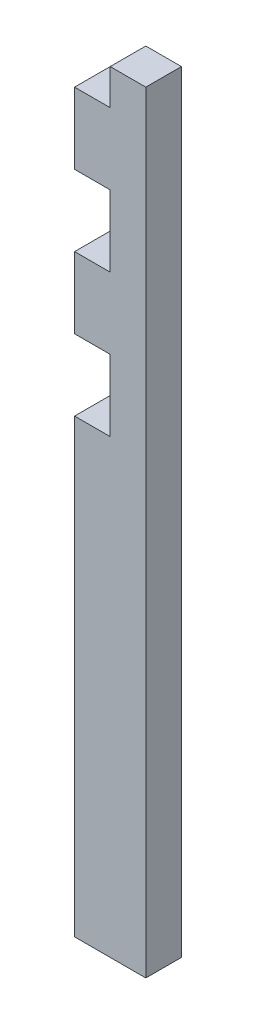
ISO-10303-21;
HEADER;
FILE_DESCRIPTION(('STEP AP214'),'2;1');
FILE_NAME('part.step','',(''),(''),'','','');
FILE_SCHEMA(('AUTOMOTIVE_DESIGN { 1 0 10303 214 1 1 1 1 }'));
ENDSEC;
DATA;
#1=APPLICATION_CONTEXT('core data for automotive mechanical design processes');
#2=APPLICATION_PROTOCOL_DEFINITION('international standard','automotive_design',2000,#1);
#3=PRODUCT_CONTEXT('',#1,'mechanical');
#4=PRODUCT('Part','Part','',(#3));
#5=PRODUCT_RELATED_PRODUCT_CATEGORY('part','',(#4));
#6=PRODUCT_DEFINITION_FORMATION('','',#4);
#7=PRODUCT_DEFINITION_CONTEXT('part definition',#1,'design');
#8=PRODUCT_DEFINITION('design','',#6,#7);
#9=PRODUCT_DEFINITION_SHAPE('','',#8);
#10=(LENGTH_UNIT() NAMED_UNIT(*) SI_UNIT(.MILLI.,.METRE.));
#11=(NAMED_UNIT(*) PLANE_ANGLE_UNIT() SI_UNIT($,.RADIAN.));
#12=(NAMED_UNIT(*) SI_UNIT($,.STERADIAN.) SOLID_ANGLE_UNIT());
#13=UNCERTAINTY_MEASURE_WITH_UNIT(LENGTH_MEASURE(1.E-05),#10,'distance_accuracy_value','');
#14=(GEOMETRIC_REPRESENTATION_CONTEXT(3) GLOBAL_UNCERTAINTY_ASSIGNED_CONTEXT((#13)) GLOBAL_UNIT_ASSIGNED_CONTEXT((#10,
#11,#12)) REPRESENTATION_CONTEXT('',''));
#15=CARTESIAN_POINT('',(0.,0.,0.));
#16=DIRECTION('',(0.,0.,1.));
#17=DIRECTION('',(1.,0.,0.));
#18=AXIS2_PLACEMENT_3D('',#15,#16,#17);
#19=CARTESIAN_POINT('',(0.,0.,6.));
#20=DIRECTION('',(-1.,0.,0.));
#21=DIRECTION('',(0.,0.,1.));
#22=AXIS2_PLACEMENT_3D('',#19,#20,#21);
#23=PLANE('',#22);
#24=DIRECTION('',(0.,0.,-1.));
#25=VECTOR('',#24,1.);
#26=CARTESIAN_POINT('',(0.,94.,6.001));
#27=LINE('',#26,#25);
#28=CARTESIAN_POINT('',(0.,94.,6.));
#29=VERTEX_POINT('',#28);
#30=CARTESIAN_POINT('',(0.,94.,0.));
#31=VERTEX_POINT('',#30);
#32=EDGE_CURVE('E153',#29,#31,#27,.T.);
#33=ORIENTED_EDGE('',*,*,#32,.T.);
#34=DIRECTION('',(0.,1.,0.));
#35=VECTOR('',#34,1.);
#36=CARTESIAN_POINT('',(0.,0.,0.));
#37=LINE('',#36,#35);
#38=CARTESIAN_POINT('',(-5.759281940243E-13,82.,0.));
#39=VERTEX_POINT('',#38);
#40=EDGE_CURVE('E182',#39,#31,#37,.T.);
#41=ORIENTED_EDGE('',*,*,#40,.F.);
#42=DIRECTION('',(0.,0.,-1.));
#43=VECTOR('',#42,1.);
#44=CARTESIAN_POINT('',(-5.759281940243E-13,82.,6.001));
#45=LINE('',#44,#43);
#46=CARTESIAN_POINT('',(0.,82.,6.));
#47=VERTEX_POINT('',#46);
#48=EDGE_CURVE('E280',#47,#39,#45,.T.);
#49=ORIENTED_EDGE('',*,*,#48,.F.);
#50=DIRECTION('',(0.,1.,0.));
#51=VECTOR('',#50,1.);
#52=CARTESIAN_POINT('',(0.,0.,6.));
#53=LINE('',#52,#51);
#54=EDGE_CURVE('E185',#47,#29,#53,.T.);
#55=ORIENTED_EDGE('',*,*,#54,.T.);
#56=EDGE_LOOP('',(#33,#41,#49,#55));
#57=FACE_BOUND('',#56,.T.);
#58=ADVANCED_FACE('F41',(#57),#23,.T.);
#59=DIRECTION('',(0.,0.,-1.));
#60=VECTOR('',#59,1.);
#61=CARTESIAN_POINT('',(-5.82867087928207E-13,70.,6.001));
#62=LINE('',#61,#60);
#63=CARTESIAN_POINT('',(0.,70.,6.));
#64=VERTEX_POINT('',#63);
#65=CARTESIAN_POINT('',(-5.82867087928207E-13,70.,0.));
#66=VERTEX_POINT('',#65);
#67=EDGE_CURVE('E276',#64,#66,#62,.T.);
#68=ORIENTED_EDGE('',*,*,#67,.T.);
#69=CARTESIAN_POINT('',(-1.16573417585641E-12,58.,0.));
#70=VERTEX_POINT('',#69);
#71=EDGE_CURVE('E181',#70,#66,#37,.T.);
#72=ORIENTED_EDGE('',*,*,#71,.F.);
#73=DIRECTION('',(0.,0.,-1.));
#74=VECTOR('',#73,1.);
#75=CARTESIAN_POINT('',(-1.16573417585641E-12,58.,6.001));
#76=LINE('',#75,#74);
#77=CARTESIAN_POINT('',(0.,58.,6.));
#78=VERTEX_POINT('',#77);
#79=EDGE_CURVE('E233',#78,#70,#76,.T.);
#80=ORIENTED_EDGE('',*,*,#79,.F.);
#81=EDGE_CURVE('E188',#78,#64,#53,.T.);
#82=ORIENTED_EDGE('',*,*,#81,.T.);
#83=EDGE_LOOP('',(#68,#72,#80,#82));
#84=FACE_BOUND('',#83,.T.);
#85=ADVANCED_FACE('F274',(#84),#23,.T.);
#86=DIRECTION('',(0.,0.,-1.));
#87=VECTOR('',#86,1.);
#88=CARTESIAN_POINT('',(-1.17267306976032E-12,46.,6.001));
#89=LINE('',#88,#87);
#90=CARTESIAN_POINT('',(0.,46.,6.));
#91=VERTEX_POINT('',#90);
#92=CARTESIAN_POINT('',(-1.17267306976032E-12,46.,0.));
#93=VERTEX_POINT('',#92);
#94=EDGE_CURVE('E201',#91,#93,#89,.T.);
#95=ORIENTED_EDGE('',*,*,#94,.T.);
#96=CARTESIAN_POINT('',(0.,-30.,0.));
#97=VERTEX_POINT('',#96);
#98=EDGE_CURVE('E176',#97,#93,#37,.T.);
#99=ORIENTED_EDGE('',*,*,#98,.F.);
#100=DIRECTION('',(0.,0.,-1.));
#101=VECTOR('',#100,1.);
#102=CARTESIAN_POINT('',(0.,-30.,6.));
#103=LINE('',#102,#101);
#104=CARTESIAN_POINT('',(0.,-30.,6.));
#105=VERTEX_POINT('',#104);
#106=EDGE_CURVE('E203',#105,#97,#103,.T.);
#107=ORIENTED_EDGE('',*,*,#106,.F.);
#108=EDGE_CURVE('E172',#105,#91,#53,.T.);
#109=ORIENTED_EDGE('',*,*,#108,.T.);
#110=EDGE_LOOP('',(#95,#99,#107,#109));
#111=FACE_BOUND('',#110,.T.);
#112=ADVANCED_FACE('F43',(#111),#23,.T.);
#113=CARTESIAN_POINT('',(12.,0.,6.));
#114=DIRECTION('',(-1.,0.,0.));
#115=DIRECTION('',(0.,0.,1.));
#116=AXIS2_PLACEMENT_3D('',#113,#114,#115);
#117=PLANE('',#116);
#118=DIRECTION('',(0.,1.,0.));
#119=VECTOR('',#118,1.);
#120=CARTESIAN_POINT('',(12.,0.,0.));
#121=LINE('',#120,#119);
#122=CARTESIAN_POINT('',(12.,-30.,0.));
#123=VERTEX_POINT('',#122);
#124=CARTESIAN_POINT('',(12.,100.,0.));
#125=VERTEX_POINT('',#124);
#126=EDGE_CURVE('E180',#123,#125,#121,.T.);
#127=ORIENTED_EDGE('',*,*,#126,.T.);
#128=DIRECTION('',(0.,0.,-1.));
#129=VECTOR('',#128,1.);
#130=CARTESIAN_POINT('',(12.,100.,6.));
#131=LINE('',#130,#129);
#132=CARTESIAN_POINT('',(12.,100.,6.));
#133=VERTEX_POINT('',#132);
#134=EDGE_CURVE('E11',#133,#125,#131,.T.);
#135=ORIENTED_EDGE('',*,*,#134,.F.);
#136=DIRECTION('',(0.,1.,0.));
#137=VECTOR('',#136,1.);
#138=CARTESIAN_POINT('',(12.,0.,6.));
#139=LINE('',#138,#137);
#140=CARTESIAN_POINT('',(12.,-30.,6.));
#141=VERTEX_POINT('',#140);
#142=EDGE_CURVE('E167',#141,#133,#139,.T.);
#143=ORIENTED_EDGE('',*,*,#142,.F.);
#144=DIRECTION('',(0.,0.,-1.));
#145=VECTOR('',#144,1.);
#146=CARTESIAN_POINT('',(12.,-30.,6.));
#147=LINE('',#146,#145);
#148=EDGE_CURVE('E253',#141,#123,#147,.T.);
#149=ORIENTED_EDGE('',*,*,#148,.T.);
#150=EDGE_LOOP('',(#127,#135,#143,#149));
#151=FACE_BOUND('',#150,.T.);
#152=ADVANCED_FACE('F338',(#151),#117,.F.);
#153=CARTESIAN_POINT('',(-1.15648231731787E-13,100.,6.));
#154=DIRECTION('',(0.,-1.,0.));
#155=DIRECTION('',(1.,0.,0.));
#156=AXIS2_PLACEMENT_3D('',#153,#154,#155);
#157=PLANE('',#156);
#158=DIRECTION('',(-1.,0.,0.));
#159=VECTOR('',#158,1.);
#160=CARTESIAN_POINT('',(-1.15648231731787E-13,100.,0.));
#161=LINE('',#160,#159);
#162=CARTESIAN_POINT('',(6.00000000000001,100.,0.));
#163=VERTEX_POINT('',#162);
#164=EDGE_CURVE('E160',#125,#163,#161,.T.);
#165=ORIENTED_EDGE('',*,*,#164,.T.);
#166=DIRECTION('',(0.,0.,-1.));
#167=VECTOR('',#166,1.);
#168=CARTESIAN_POINT('',(6.00000000000001,100.,6.001));
#169=LINE('',#168,#167);
#170=CARTESIAN_POINT('',(6.00000000000001,100.,6.));
#171=VERTEX_POINT('',#170);
#172=EDGE_CURVE('E146',#171,#163,#169,.T.);
#173=ORIENTED_EDGE('',*,*,#172,.F.);
#174=DIRECTION('',(-1.,0.,0.));
#175=VECTOR('',#174,1.);
#176=CARTESIAN_POINT('',(-1.15648231731787E-13,100.,6.));
#177=LINE('',#176,#175);
#178=EDGE_CURVE('E50',#133,#171,#177,.T.);
#179=ORIENTED_EDGE('',*,*,#178,.F.);
#180=ORIENTED_EDGE('',*,*,#134,.T.);
#181=EDGE_LOOP('',(#165,#173,#179,#180));
#182=FACE_BOUND('',#181,.T.);
#183=ADVANCED_FACE('F158',(#182),#157,.F.);
#184=CARTESIAN_POINT('',(0.,0.,6.));
#185=DIRECTION('',(0.,0.,1.));
#186=DIRECTION('',(1.,0.,0.));
#187=AXIS2_PLACEMENT_3D('',#184,#185,#186);
#188=PLANE('',#187);
#189=DIRECTION('',(0.,-1.,0.));
#190=VECTOR('',#189,1.);
#191=CARTESIAN_POINT('',(6.00000000000001,106.,6.));
#192=LINE('',#191,#190);
#193=CARTESIAN_POINT('',(6.00000000000001,94.,6.));
#194=VERTEX_POINT('',#193);
#195=EDGE_CURVE('E143',#171,#194,#192,.T.);
#196=ORIENTED_EDGE('',*,*,#195,.T.);
#197=DIRECTION('',(-1.,0.,0.));
#198=VECTOR('',#197,1.);
#199=CARTESIAN_POINT('',(0.,94.,6.));
#200=LINE('',#199,#198);
#201=EDGE_CURVE('E162',#194,#29,#200,.T.);
#202=ORIENTED_EDGE('',*,*,#201,.T.);
#203=ORIENTED_EDGE('',*,*,#54,.F.);
#204=DIRECTION('',(1.,0.,0.));
#205=VECTOR('',#204,1.);
#206=CARTESIAN_POINT('',(-5.759281940243E-13,82.,6.));
#207=LINE('',#206,#205);
#208=CARTESIAN_POINT('',(5.99999999999942,82.,6.));
#209=VERTEX_POINT('',#208);
#210=EDGE_CURVE('E299',#47,#209,#207,.T.);
#211=ORIENTED_EDGE('',*,*,#210,.T.);
#212=DIRECTION('',(0.,-1.,0.));
#213=VECTOR('',#212,1.);
#214=CARTESIAN_POINT('',(5.99999999999942,82.,6.));
#215=LINE('',#214,#213);
#216=CARTESIAN_POINT('',(5.99999999999942,70.,6.));
#217=VERTEX_POINT('',#216);
#218=EDGE_CURVE('E163',#209,#217,#215,.T.);
#219=ORIENTED_EDGE('',*,*,#218,.T.);
#220=DIRECTION('',(-1.,0.,0.));
#221=VECTOR('',#220,1.);
#222=CARTESIAN_POINT('',(-5.82867087928207E-13,70.,6.));
#223=LINE('',#222,#221);
#224=EDGE_CURVE('E246',#217,#64,#223,.T.);
#225=ORIENTED_EDGE('',*,*,#224,.T.);
#226=ORIENTED_EDGE('',*,*,#81,.F.);
#227=DIRECTION('',(1.,0.,0.));
#228=VECTOR('',#227,1.);
#229=CARTESIAN_POINT('',(-1.16573417585641E-12,58.,6.));
#230=LINE('',#229,#228);
#231=CARTESIAN_POINT('',(5.99999999999883,58.,6.));
#232=VERTEX_POINT('',#231);
#233=EDGE_CURVE('E215',#78,#232,#230,.T.);
#234=ORIENTED_EDGE('',*,*,#233,.T.);
#235=DIRECTION('',(0.,-1.,0.));
#236=VECTOR('',#235,1.);
#237=CARTESIAN_POINT('',(5.99999999999883,58.,6.));
#238=LINE('',#237,#236);
#239=CARTESIAN_POINT('',(5.99999999999883,46.,6.));
#240=VERTEX_POINT('',#239);
#241=EDGE_CURVE('E211',#232,#240,#238,.T.);
#242=ORIENTED_EDGE('',*,*,#241,.T.);
#243=DIRECTION('',(-1.,0.,0.));
#244=VECTOR('',#243,1.);
#245=CARTESIAN_POINT('',(-1.17267306976032E-12,46.,6.));
#246=LINE('',#245,#244);
#247=EDGE_CURVE('E209',#240,#91,#246,.T.);
#248=ORIENTED_EDGE('',*,*,#247,.T.);
#249=ORIENTED_EDGE('',*,*,#108,.F.);
#250=DIRECTION('',(1.,0.,0.));
#251=VECTOR('',#250,1.);
#252=CARTESIAN_POINT('',(0.,-30.,6.));
#253=LINE('',#252,#251);
#254=EDGE_CURVE('E206',#105,#141,#253,.T.);
#255=ORIENTED_EDGE('',*,*,#254,.T.);
#256=ORIENTED_EDGE('',*,*,#142,.T.);
#257=ORIENTED_EDGE('',*,*,#178,.T.);
#258=EDGE_LOOP('',(#196,#202,#203,#211,#219,#225,#226,#234,#242,#248,#249,#255,#256,#257));
#259=FACE_BOUND('',#258,.T.);
#260=ADVANCED_FACE('F165',(#259),#188,.T.);
#261=CARTESIAN_POINT('',(0.,0.,0.));
#262=DIRECTION('',(0.,0.,1.));
#263=DIRECTION('',(1.,0.,0.));
#264=AXIS2_PLACEMENT_3D('',#261,#262,#263);
#265=PLANE('',#264);
#266=DIRECTION('',(-1.,0.,0.));
#267=VECTOR('',#266,1.);
#268=CARTESIAN_POINT('',(0.,94.,0.));
#269=LINE('',#268,#267);
#270=CARTESIAN_POINT('',(6.00000000000001,94.,0.));
#271=VERTEX_POINT('',#270);
#272=EDGE_CURVE('E307',#271,#31,#269,.T.);
#273=ORIENTED_EDGE('',*,*,#272,.F.);
#274=DIRECTION('',(0.,-1.,0.));
#275=VECTOR('',#274,1.);
#276=CARTESIAN_POINT('',(6.00000000000001,106.,0.));
#277=LINE('',#276,#275);
#278=EDGE_CURVE('E57',#163,#271,#277,.T.);
#279=ORIENTED_EDGE('',*,*,#278,.F.);
#280=ORIENTED_EDGE('',*,*,#164,.F.);
#281=ORIENTED_EDGE('',*,*,#126,.F.);
#282=DIRECTION('',(1.,0.,0.));
#283=VECTOR('',#282,1.);
#284=CARTESIAN_POINT('',(0.,-30.,0.));
#285=LINE('',#284,#283);
#286=EDGE_CURVE('E152',#97,#123,#285,.T.);
#287=ORIENTED_EDGE('',*,*,#286,.F.);
#288=ORIENTED_EDGE('',*,*,#98,.T.);
#289=DIRECTION('',(-1.,0.,0.));
#290=VECTOR('',#289,1.);
#291=CARTESIAN_POINT('',(-1.17267306976032E-12,46.,0.));
#292=LINE('',#291,#290);
#293=CARTESIAN_POINT('',(5.99999999999883,46.,0.));
#294=VERTEX_POINT('',#293);
#295=EDGE_CURVE('E229',#294,#93,#292,.T.);
#296=ORIENTED_EDGE('',*,*,#295,.F.);
#297=DIRECTION('',(0.,-1.,0.));
#298=VECTOR('',#297,1.);
#299=CARTESIAN_POINT('',(5.99999999999883,58.,0.));
#300=LINE('',#299,#298);
#301=CARTESIAN_POINT('',(5.99999999999883,58.,0.));
#302=VERTEX_POINT('',#301);
#303=EDGE_CURVE('E225',#302,#294,#300,.T.);
#304=ORIENTED_EDGE('',*,*,#303,.F.);
#305=DIRECTION('',(1.,0.,0.));
#306=VECTOR('',#305,1.);
#307=CARTESIAN_POINT('',(-1.16573417585641E-12,58.,0.));
#308=LINE('',#307,#306);
#309=EDGE_CURVE('E218',#70,#302,#308,.T.);
#310=ORIENTED_EDGE('',*,*,#309,.F.);
#311=ORIENTED_EDGE('',*,*,#71,.T.);
#312=DIRECTION('',(-1.,0.,0.));
#313=VECTOR('',#312,1.);
#314=CARTESIAN_POINT('',(-5.82867087928207E-13,70.,0.));
#315=LINE('',#314,#313);
#316=CARTESIAN_POINT('',(5.99999999999942,70.,0.));
#317=VERTEX_POINT('',#316);
#318=EDGE_CURVE('E269',#317,#66,#315,.T.);
#319=ORIENTED_EDGE('',*,*,#318,.F.);
#320=DIRECTION('',(0.,-1.,0.));
#321=VECTOR('',#320,1.);
#322=CARTESIAN_POINT('',(5.99999999999942,82.,0.));
#323=LINE('',#322,#321);
#324=CARTESIAN_POINT('',(5.99999999999942,82.,0.));
#325=VERTEX_POINT('',#324);
#326=EDGE_CURVE('E293',#325,#317,#323,.T.);
#327=ORIENTED_EDGE('',*,*,#326,.F.);
#328=DIRECTION('',(1.,0.,0.));
#329=VECTOR('',#328,1.);
#330=CARTESIAN_POINT('',(-5.759281940243E-13,82.,0.));
#331=LINE('',#330,#329);
#332=EDGE_CURVE('E65',#39,#325,#331,.T.);
#333=ORIENTED_EDGE('',*,*,#332,.F.);
#334=ORIENTED_EDGE('',*,*,#40,.T.);
#335=EDGE_LOOP('',(#273,#279,#280,#281,#287,#288,#296,#304,#310,#311,#319,#327,#333,#334));
#336=FACE_BOUND('',#335,.T.);
#337=ADVANCED_FACE('F267',(#336),#265,.F.);
#338=CARTESIAN_POINT('',(0.,-30.,6.));
#339=DIRECTION('',(0.,1.,0.));
#340=DIRECTION('',(0.,0.,1.));
#341=AXIS2_PLACEMENT_3D('',#338,#339,#340);
#342=PLANE('',#341);
#343=ORIENTED_EDGE('',*,*,#286,.T.);
#344=ORIENTED_EDGE('',*,*,#148,.F.);
#345=ORIENTED_EDGE('',*,*,#254,.F.);
#346=ORIENTED_EDGE('',*,*,#106,.T.);
#347=EDGE_LOOP('',(#343,#344,#345,#346));
#348=FACE_BOUND('',#347,.T.);
#349=ADVANCED_FACE('F349',(#348),#342,.F.);
#350=CARTESIAN_POINT('',(-1.16573417585641E-12,58.,6.001));
#351=DIRECTION('',(0.,1.,0.));
#352=DIRECTION('',(0.,0.,1.));
#353=AXIS2_PLACEMENT_3D('',#350,#351,#352);
#354=PLANE('',#353);
#355=ORIENTED_EDGE('',*,*,#79,.T.);
#356=ORIENTED_EDGE('',*,*,#309,.T.);
#357=DIRECTION('',(0.,0.,-1.));
#358=VECTOR('',#357,1.);
#359=CARTESIAN_POINT('',(5.99999999999883,58.,6.001));
#360=LINE('',#359,#358);
#361=EDGE_CURVE('E232',#232,#302,#360,.T.);
#362=ORIENTED_EDGE('',*,*,#361,.F.);
#363=ORIENTED_EDGE('',*,*,#233,.F.);
#364=EDGE_LOOP('',(#355,#356,#362,#363));
#365=FACE_BOUND('',#364,.T.);
#366=ADVANCED_FACE('F354',(#365),#354,.F.);
#367=CARTESIAN_POINT('',(-1.17267306976032E-12,46.,6.001));
#368=DIRECTION('',(0.,-1.,0.));
#369=DIRECTION('',(0.,0.,-1.));
#370=AXIS2_PLACEMENT_3D('',#367,#368,#369);
#371=PLANE('',#370);
#372=DIRECTION('',(0.,0.,-1.));
#373=VECTOR('',#372,1.);
#374=CARTESIAN_POINT('',(5.99999999999883,46.,6.001));
#375=LINE('',#374,#373);
#376=EDGE_CURVE('E238',#240,#294,#375,.T.);
#377=ORIENTED_EDGE('',*,*,#376,.T.);
#378=ORIENTED_EDGE('',*,*,#295,.T.);
#379=ORIENTED_EDGE('',*,*,#94,.F.);
#380=ORIENTED_EDGE('',*,*,#247,.F.);
#381=EDGE_LOOP('',(#377,#378,#379,#380));
#382=FACE_BOUND('',#381,.T.);
#383=ADVANCED_FACE('F358',(#382),#371,.F.);
#384=CARTESIAN_POINT('',(5.99999999999883,58.,6.001));
#385=DIRECTION('',(1.,0.,0.));
#386=DIRECTION('',(0.,0.,-1.));
#387=AXIS2_PLACEMENT_3D('',#384,#385,#386);
#388=PLANE('',#387);
#389=ORIENTED_EDGE('',*,*,#361,.T.);
#390=ORIENTED_EDGE('',*,*,#303,.T.);
#391=ORIENTED_EDGE('',*,*,#376,.F.);
#392=ORIENTED_EDGE('',*,*,#241,.F.);
#393=EDGE_LOOP('',(#389,#390,#391,#392));
#394=FACE_BOUND('',#393,.T.);
#395=ADVANCED_FACE('F330',(#394),#388,.F.);
#396=CARTESIAN_POINT('',(-5.759281940243E-13,82.,6.001));
#397=DIRECTION('',(0.,1.,0.));
#398=DIRECTION('',(0.,0.,1.));
#399=AXIS2_PLACEMENT_3D('',#396,#397,#398);
#400=PLANE('',#399);
#401=ORIENTED_EDGE('',*,*,#48,.T.);
#402=ORIENTED_EDGE('',*,*,#332,.T.);
#403=DIRECTION('',(0.,0.,-1.));
#404=VECTOR('',#403,1.);
#405=CARTESIAN_POINT('',(5.99999999999942,82.,6.001));
#406=LINE('',#405,#404);
#407=EDGE_CURVE('E286',#209,#325,#406,.T.);
#408=ORIENTED_EDGE('',*,*,#407,.F.);
#409=ORIENTED_EDGE('',*,*,#210,.F.);
#410=EDGE_LOOP('',(#401,#402,#408,#409));
#411=FACE_BOUND('',#410,.T.);
#412=ADVANCED_FACE('F317',(#411),#400,.F.);
#413=CARTESIAN_POINT('',(-5.82867087928207E-13,70.,6.001));
#414=DIRECTION('',(0.,-1.,0.));
#415=DIRECTION('',(0.,0.,-1.));
#416=AXIS2_PLACEMENT_3D('',#413,#414,#415);
#417=PLANE('',#416);
#418=DIRECTION('',(0.,0.,-1.));
#419=VECTOR('',#418,1.);
#420=CARTESIAN_POINT('',(5.99999999999942,70.,6.001));
#421=LINE('',#420,#419);
#422=EDGE_CURVE('E281',#217,#317,#421,.T.);
#423=ORIENTED_EDGE('',*,*,#422,.T.);
#424=ORIENTED_EDGE('',*,*,#318,.T.);
#425=ORIENTED_EDGE('',*,*,#67,.F.);
#426=ORIENTED_EDGE('',*,*,#224,.F.);
#427=EDGE_LOOP('',(#423,#424,#425,#426));
#428=FACE_BOUND('',#427,.T.);
#429=ADVANCED_FACE('F322',(#428),#417,.F.);
#430=CARTESIAN_POINT('',(5.99999999999942,82.,6.001));
#431=DIRECTION('',(1.,0.,0.));
#432=DIRECTION('',(0.,0.,-1.));
#433=AXIS2_PLACEMENT_3D('',#430,#431,#432);
#434=PLANE('',#433);
#435=ORIENTED_EDGE('',*,*,#407,.T.);
#436=ORIENTED_EDGE('',*,*,#326,.T.);
#437=ORIENTED_EDGE('',*,*,#422,.F.);
#438=ORIENTED_EDGE('',*,*,#218,.F.);
#439=EDGE_LOOP('',(#435,#436,#437,#438));
#440=FACE_BOUND('',#439,.T.);
#441=ADVANCED_FACE('F319',(#440),#434,.F.);
#442=CARTESIAN_POINT('',(6.00000000000001,106.,6.001));
#443=DIRECTION('',(1.,0.,0.));
#444=DIRECTION('',(0.,0.,-1.));
#445=AXIS2_PLACEMENT_3D('',#442,#443,#444);
#446=PLANE('',#445);
#447=ORIENTED_EDGE('',*,*,#172,.T.);
#448=ORIENTED_EDGE('',*,*,#278,.T.);
#449=DIRECTION('',(0.,0.,-1.));
#450=VECTOR('',#449,1.);
#451=CARTESIAN_POINT('',(6.00000000000001,94.,6.001));
#452=LINE('',#451,#450);
#453=EDGE_CURVE('E147',#194,#271,#452,.T.);
#454=ORIENTED_EDGE('',*,*,#453,.F.);
#455=ORIENTED_EDGE('',*,*,#195,.F.);
#456=EDGE_LOOP('',(#447,#448,#454,#455));
#457=FACE_BOUND('',#456,.T.);
#458=ADVANCED_FACE('F145',(#457),#446,.F.);
#459=CARTESIAN_POINT('',(0.,94.,6.001));
#460=DIRECTION('',(0.,-1.,0.));
#461=DIRECTION('',(0.,0.,-1.));
#462=AXIS2_PLACEMENT_3D('',#459,#460,#461);
#463=PLANE('',#462);
#464=ORIENTED_EDGE('',*,*,#453,.T.);
#465=ORIENTED_EDGE('',*,*,#272,.T.);
#466=ORIENTED_EDGE('',*,*,#32,.F.);
#467=ORIENTED_EDGE('',*,*,#201,.F.);
#468=EDGE_LOOP('',(#464,#465,#466,#467));
#469=FACE_BOUND('',#468,.T.);
#470=ADVANCED_FACE('F316',(#469),#463,.F.);
#471=CLOSED_SHELL('',(#58,#85,#112,#152,#183,#260,#337,#349,#366,#383,#395,#412,#429,#441,#458,#470));
#472=MANIFOLD_SOLID_BREP('B2',#471);
#473=ADVANCED_BREP_SHAPE_REPRESENTATION('',(#18,#472),#14);
#474=SHAPE_DEFINITION_REPRESENTATION(#9,#473);
ENDSEC;
END-ISO-10303-21;
